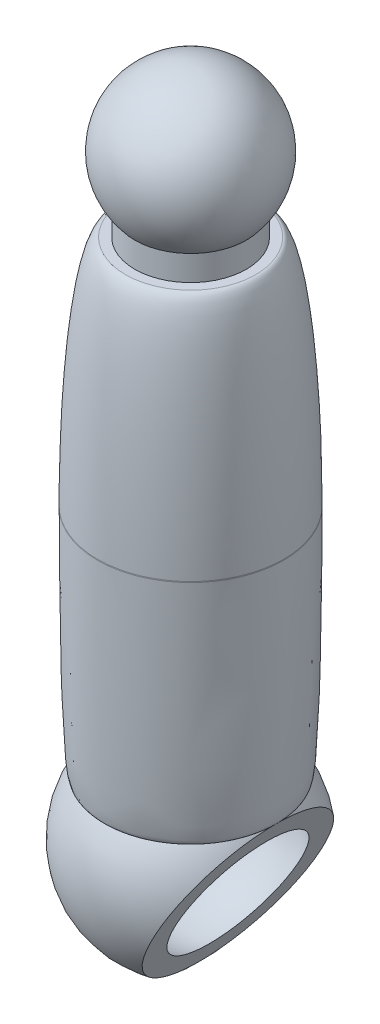
ISO-10303-21;
HEADER;
FILE_DESCRIPTION(('STEP AP214'),'2;1');
FILE_NAME('part.step','',(''),(''),'','','');
FILE_SCHEMA(('AUTOMOTIVE_DESIGN { 1 0 10303 214 1 1 1 1 }'));
ENDSEC;
DATA;
#1=APPLICATION_CONTEXT('core data for automotive mechanical design processes');
#2=APPLICATION_PROTOCOL_DEFINITION('international standard','automotive_design',2000,#1);
#3=PRODUCT_CONTEXT('',#1,'mechanical');
#4=PRODUCT('Part','Part','',(#3));
#5=PRODUCT_RELATED_PRODUCT_CATEGORY('part','',(#4));
#6=PRODUCT_DEFINITION_FORMATION('','',#4);
#7=PRODUCT_DEFINITION_CONTEXT('part definition',#1,'design');
#8=PRODUCT_DEFINITION('design','',#6,#7);
#9=PRODUCT_DEFINITION_SHAPE('','',#8);
#10=(LENGTH_UNIT() NAMED_UNIT(*) SI_UNIT(.MILLI.,.METRE.));
#11=(NAMED_UNIT(*) PLANE_ANGLE_UNIT() SI_UNIT($,.RADIAN.));
#12=(NAMED_UNIT(*) SI_UNIT($,.STERADIAN.) SOLID_ANGLE_UNIT());
#13=UNCERTAINTY_MEASURE_WITH_UNIT(LENGTH_MEASURE(1.E-05),#10,'distance_accuracy_value','');
#14=(GEOMETRIC_REPRESENTATION_CONTEXT(3) GLOBAL_UNCERTAINTY_ASSIGNED_CONTEXT((#13)) GLOBAL_UNIT_ASSIGNED_CONTEXT((#10,
#11,#12)) REPRESENTATION_CONTEXT('',''));
#15=CARTESIAN_POINT('',(0.,0.,0.));
#16=DIRECTION('',(0.,0.,1.));
#17=DIRECTION('',(1.,0.,0.));
#18=AXIS2_PLACEMENT_3D('',#15,#16,#17);
#19=CARTESIAN_POINT('',(0.,0.,0.));
#20=DIRECTION('',(0.,1.,0.));
#21=DIRECTION('',(-1.,0.,0.));
#22=AXIS2_PLACEMENT_3D('',#19,#20,#21);
#23=SPHERICAL_SURFACE('',#22,4.5);
#24=CARTESIAN_POINT('',(0.,3.,0.));
#25=DIRECTION('',(0.,1.,0.));
#26=DIRECTION('',(0.,0.,1.));
#27=AXIS2_PLACEMENT_3D('',#24,#25,#26);
#28=CIRCLE('',#27,3.35410196624968);
#29=CARTESIAN_POINT('',(0.,3.,3.35410196624968));
#30=VERTEX_POINT('',#29);
#31=EDGE_CURVE('E62',#30,#30,#28,.T.);
#32=ORIENTED_EDGE('',*,*,#31,.T.);
#33=EDGE_LOOP('',(#32));
#34=FACE_BOUND('',#33,.T.);
#35=CARTESIAN_POINT('',(2.54225355443142,-1.23973661113189,0.));
#36=DIRECTION('',(0.898822363917032,-0.438313082308296,0.));
#37=DIRECTION('',(0.438313082308296,0.898822363917032,0.));
#38=AXIS2_PLACEMENT_3D('',#35,#36,#37);
#39=CIRCLE('',#38,3.5);
#40=CARTESIAN_POINT('',(4.07634934251046,1.90614166257772,0.));
#41=VERTEX_POINT('',#40);
#42=EDGE_CURVE('E59',#41,#41,#39,.T.);
#43=ORIENTED_EDGE('',*,*,#42,.T.);
#44=EDGE_LOOP('',(#43));
#45=FACE_BOUND('',#44,.T.);
#46=ADVANCED_FACE('F38',(#34,#45),#23,.F.);
#47=CARTESIAN_POINT('',(0.,3.,0.));
#48=DIRECTION('',(0.,1.,0.));
#49=DIRECTION('',(0.,0.,1.));
#50=AXIS2_PLACEMENT_3D('',#47,#48,#49);
#51=PLANE('',#50);
#52=ORIENTED_EDGE('',*,*,#31,.F.);
#53=EDGE_LOOP('',(#52));
#54=FACE_BOUND('',#53,.T.);
#55=ADVANCED_FACE('F97',(#54),#51,.F.);
#56=CARTESIAN_POINT('',(0.474734880216405,-5.47947322226379,10.));
#57=DIRECTION('',(0.898822363917032,-0.438313082308296,0.));
#58=DIRECTION('',(0.438313082308296,0.898822363917032,0.));
#59=AXIS2_PLACEMENT_3D('',#56,#57,#58);
#60=PLANE('',#59);
#61=ORIENTED_EDGE('',*,*,#42,.F.);
#62=EDGE_LOOP('',(#61));
#63=FACE_BOUND('',#62,.T.);
#64=CARTESIAN_POINT('',(2.54225355443142,-1.23973661113189,0.));
#65=DIRECTION('',(0.898822363917032,-0.438313082308296,0.));
#66=DIRECTION('',(0.438313082308296,0.898822363917032,0.));
#67=AXIS2_PLACEMENT_3D('',#64,#65,#66);
#68=CIRCLE('',#67,4.7169905660283);
#69=CARTESIAN_POINT('',(4.60977222864644,3.,0.));
#70=VERTEX_POINT('',#69);
#71=EDGE_CURVE('E54',#70,#70,#68,.F.);
#72=ORIENTED_EDGE('',*,*,#71,.F.);
#73=EDGE_LOOP('',(#72));
#74=FACE_BOUND('',#73,.T.);
#75=ADVANCED_FACE('F55',(#63,#74),#60,.T.);
#76=CARTESIAN_POINT('',(0.,0.,0.));
#77=DIRECTION('',(0.,1.,0.));
#78=DIRECTION('',(1.,0.,0.));
#79=AXIS2_PLACEMENT_3D('',#76,#77,#78);
#80=SPHERICAL_SURFACE('',#79,5.5);
#81=CARTESIAN_POINT('',(0.,3.,4.60977222864644));
#82=CARTESIAN_POINT('',(0.603417765466815,3.,4.60977222864644));
#83=CARTESIAN_POINT('',(1.20659813581132,3.0000000000004,4.48979219322418));
#84=CARTESIAN_POINT('',(2.32156878194807,2.99999999999961,4.02795622994659));
#85=CARTESIAN_POINT('',(2.83292040875123,3.0000000000004,3.68628199645152));
#86=CARTESIAN_POINT('',(3.68628199645141,2.9999999999996,2.83292040875114));
#87=CARTESIAN_POINT('',(4.02795622994622,2.99999999999961,2.3215687819482));
#88=CARTESIAN_POINT('',(4.48979219322456,3.0000000000004,1.20659813581118));
#89=CARTESIAN_POINT('',(4.60977222864644,3.,0.603417765466814));
#90=CARTESIAN_POINT('',(4.60977222864644,3.,-0.603417765466815));
#91=CARTESIAN_POINT('',(4.48979219322436,3.0000000000004,-1.20659813581118));
#92=CARTESIAN_POINT('',(4.02795622994642,2.9999999999996,-2.3215687819482));
#93=CARTESIAN_POINT('',(3.68628199645158,3.,-2.83292040875127));
#94=CARTESIAN_POINT('',(2.83292040875107,3.,-3.68628199645138));
#95=CARTESIAN_POINT('',(2.32156878194814,2.9999999999996,-4.02795622994686));
#96=CARTESIAN_POINT('',(1.20659813581124,3.0000000000004,-4.48979219322392));
#97=CARTESIAN_POINT('',(0.603417765466772,3.,-4.60977222864644));
#98=CARTESIAN_POINT('',(-0.603417765466772,3.,-4.60977222864644));
#99=CARTESIAN_POINT('',(-1.20659813581173,3.0000000000004,-4.48979219322392));
#100=CARTESIAN_POINT('',(-2.32156878194765,2.9999999999996,-4.02795622994686));
#101=CARTESIAN_POINT('',(-2.83292040875087,3.0000000000004,-3.68628199645158));
#102=CARTESIAN_POINT('',(-3.68628199645178,2.9999999999996,-2.83292040875107));
#103=CARTESIAN_POINT('',(-4.02795622994662,2.99999999999961,-2.32156878194781));
#104=CARTESIAN_POINT('',(-4.48979219322416,3.0000000000004,-1.20659813581158));
#105=CARTESIAN_POINT('',(-4.60977222864644,3.,-0.603417765466348));
#106=CARTESIAN_POINT('',(-4.60977222864644,3.,0.603417765466342));
#107=CARTESIAN_POINT('',(-4.48979219322376,3.0000000000004,1.20659813581163));
#108=CARTESIAN_POINT('',(-4.02795622994701,2.99999999999961,2.32156878194776));
#109=CARTESIAN_POINT('',(-3.68628199645161,2.9999999999996,2.83292040875103));
#110=CARTESIAN_POINT('',(-2.83292040875104,3.0000000000004,3.68628199645161));
#111=CARTESIAN_POINT('',(-2.32156878194821,2.9999999999996,4.0279562299466));
#112=CARTESIAN_POINT('',(-1.20659813581116,3.0000000000004,4.48979219322418));
#113=CARTESIAN_POINT('',(-0.603417765466813,3.,4.60977222864644));
#114=CARTESIAN_POINT('',(0.,3.,4.60977222864644));
#115=(BOUNDED_CURVE() B_SPLINE_CURVE(3,(#81,#82,#83,#84,#85,#86,#87,#88,#89,#90,#91,#92,#93,#94,
#95,#96,#97,#98,#99,#100,#101,#102,#103,#104,#105,#106,#107,#108,#109,#110,#111,#112,#113,#114),
.UNSPECIFIED.,.T.,.F.) B_SPLINE_CURVE_WITH_KNOTS((4,2,2,2,2,2,2,2,2,2,2,2,2,2,2,2,4),
(-3.14159265358979,-2.74889357189107,-2.35619449019234,-1.96349540849362,-1.5707963267949,
-1.17809724509617,-0.785398163397448,-0.392699081698724,0.,0.392699081698724,0.785398163397448,
1.17809724509617,1.5707963267949,1.96349540849362,2.35619449019234,2.74889357189107,
3.14159265358979),
.UNSPECIFIED.) CURVE() GEOMETRIC_REPRESENTATION_ITEM() RATIONAL_B_SPLINE_CURVE((1.,1.,1.,1.,1.,
1.,1.,1.,1.,1.,1.,1.,1.,1.,1.,1.,1.,1.,1.,1.,1.,1.,1.,1.,1.,1.,1.,1.,1.,1.,1.,1.,1.,1.)) REPRESENTATION_ITEM(''));
#116=EDGE_CURVE('E70',#70,#70,#115,.F.);
#117=ORIENTED_EDGE('',*,*,#116,.T.);
#118=ORIENTED_EDGE('',*,*,#71,.T.);
#119=EDGE_LOOP('',(#117,#118));
#120=FACE_BOUND('',#119,.T.);
#121=ADVANCED_FACE('F104',(#120),#80,.T.);
#122=CARTESIAN_POINT('',(0.,28.,0.));
#123=DIRECTION('',(0.,-1.,0.));
#124=DIRECTION('',(0.,0.,-1.));
#125=AXIS2_PLACEMENT_3D('',#122,#123,#124);
#126=CYLINDRICAL_SURFACE('',#125,5.);
#127=CARTESIAN_POINT('',(0.,15.4506387627513,5.));
#128=CARTESIAN_POINT('',(-0.654498460593132,15.4506387627513,5.));
#129=CARTESIAN_POINT('',(-1.30873943002339,15.4506387627517,4.86986337993385));
#130=CARTESIAN_POINT('',(-2.51809489362749,15.4506387627509,4.36893194517903));
#131=CARTESIAN_POINT('',(-3.07273360617101,15.4506387627525,3.99833420569446));
#132=CARTESIAN_POINT('',(-3.99833420569447,15.4506387627501,3.07273360617101));
#133=CARTESIAN_POINT('',(-4.36893194517922,15.4506387627509,2.51809489362703));
#134=CARTESIAN_POINT('',(-4.86986337993365,15.4506387627517,1.30873943002388));
#135=CARTESIAN_POINT('',(-5.,15.4506387627513,0.654498460592621));
#136=CARTESIAN_POINT('',(-5.,15.4506387627513,-0.654498460592627));
#137=CARTESIAN_POINT('',(-4.86986337993369,15.4506387627517,-1.30873943002378));
#138=CARTESIAN_POINT('',(-4.36893194517918,15.4506387627509,-2.51809489362712));
#139=CARTESIAN_POINT('',(-3.99833420569449,15.4506387627505,-3.07273360617098));
#140=CARTESIAN_POINT('',(-3.07273360617098,15.4506387627521,-3.9983342056945));
#141=CARTESIAN_POINT('',(-2.51809489362705,15.4506387627509,-4.36893194517921));
#142=CARTESIAN_POINT('',(-1.30873943002385,15.4506387627517,-4.86986337993366));
#143=CARTESIAN_POINT('',(-0.654498460593086,15.4506387627513,-5.));
#144=CARTESIAN_POINT('',(0.654498460593086,15.4506387627513,-5.));
#145=CARTESIAN_POINT('',(1.3087394300234,15.4506387627517,-4.86986337993384));
#146=CARTESIAN_POINT('',(2.5180948936275,15.4506387627509,-4.36893194517902));
#147=CARTESIAN_POINT('',(3.07273360617128,15.4506387627513,-3.9983342056942));
#148=CARTESIAN_POINT('',(3.9983342056942,15.4506387627513,-3.07273360617128));
#149=CARTESIAN_POINT('',(4.36893194517899,15.4506387627509,-2.51809489362759));
#150=CARTESIAN_POINT('',(4.86986337993388,15.4506387627517,-1.30873943002331));
#151=CARTESIAN_POINT('',(5.,15.4506387627513,-0.654498460593133));
#152=CARTESIAN_POINT('',(5.,15.4506387627513,0.654498460593133));
#153=CARTESIAN_POINT('',(4.86986337993391,15.4506387627517,1.30873943002324));
#154=CARTESIAN_POINT('',(4.36893194517896,15.4506387627509,2.51809489362766));
#155=CARTESIAN_POINT('',(3.99833420569426,15.4506387627501,3.07273360617121));
#156=CARTESIAN_POINT('',(3.07273360617121,15.4506387627525,3.99833420569427));
#157=CARTESIAN_POINT('',(2.51809489362745,15.4506387627509,4.36893194517904));
#158=CARTESIAN_POINT('',(1.30873943002346,15.4506387627517,4.86986337993382));
#159=CARTESIAN_POINT('',(0.654498460593133,15.4506387627513,5.));
#160=CARTESIAN_POINT('',(0.,15.4506387627513,5.));
#161=(BOUNDED_CURVE() B_SPLINE_CURVE(3,(#127,#128,#129,#130,#131,#132,#133,#134,#135,#136,#137,
#138,#139,#140,#141,#142,#143,#144,#145,#146,#147,#148,#149,#150,#151,#152,#153,#154,#155,#156,
#157,#158,#159,#160),.UNSPECIFIED.,.T.,.F.) B_SPLINE_CURVE_WITH_KNOTS((4,2,2,2,2,2,2,2,2,2,2,2,
2,2,2,2,4),(-3.14159265358979,-2.74889357189107,-2.35619449019234,-1.96349540849362,
-1.5707963267949,-1.17809724509617,-0.785398163397448,-0.392699081698724,0.,0.392699081698724,
0.785398163397448,1.17809724509617,1.5707963267949,1.96349540849362,2.35619449019234,
2.74889357189107,3.14159265358979),
.UNSPECIFIED.) CURVE() GEOMETRIC_REPRESENTATION_ITEM() RATIONAL_B_SPLINE_CURVE((1.,1.,1.,1.,1.,
1.,1.,1.,1.,1.,1.,1.,1.,1.,1.,1.,1.,1.,1.,1.,1.,1.,1.,1.,1.,1.,1.,1.,1.,1.,1.,1.,1.,1.)) REPRESENTATION_ITEM(''));
#162=CARTESIAN_POINT('',(0.,15.4506387627513,5.));
#163=VERTEX_POINT('',#162);
#164=EDGE_CURVE('E12',#163,#163,#161,.F.);
#165=ORIENTED_EDGE('',*,*,#164,.T.);
#166=EDGE_LOOP('',(#165));
#167=FACE_BOUND('',#166,.T.);
#168=CARTESIAN_POINT('',(0.,15.5,5.));
#169=CARTESIAN_POINT('',(1.30899692118617,15.5,5.));
#170=CARTESIAN_POINT('',(2.60993330640972,15.5,4.46113450545575));
#171=CARTESIAN_POINT('',(4.46113450545575,15.5,2.60993330640972));
#172=CARTESIAN_POINT('',(5.,15.5,1.30899692118627));
#173=CARTESIAN_POINT('',(5.,15.5,-1.30899692118626));
#174=CARTESIAN_POINT('',(4.46113450545589,15.5,-2.60993330640959));
#175=CARTESIAN_POINT('',(2.60993330640958,15.5,-4.46113450545589));
#176=CARTESIAN_POINT('',(1.30899692118627,15.5,-5.));
#177=CARTESIAN_POINT('',(-1.30899692118626,15.5,-5.));
#178=CARTESIAN_POINT('',(-2.60993330640929,15.5,-4.46113450545619));
#179=CARTESIAN_POINT('',(-4.46113450545619,15.5,-2.60993330640928));
#180=CARTESIAN_POINT('',(-5.,15.5,-1.30899692118626));
#181=CARTESIAN_POINT('',(-5.,15.5,1.30899692118627));
#182=CARTESIAN_POINT('',(-4.46113450545605,15.5,2.60993330640942));
#183=CARTESIAN_POINT('',(-2.60993330640945,15.5,4.46113450545603));
#184=CARTESIAN_POINT('',(-1.30899692118617,15.5,5.));
#185=CARTESIAN_POINT('',(0.,15.5,5.));
#186=(BOUNDED_CURVE() B_SPLINE_CURVE(3,(#168,#169,#170,#171,#172,#173,#174,#175,#176,#177,#178,
#179,#180,#181,#182,#183,#184,#185),.UNSPECIFIED.,.T.,.F.) B_SPLINE_CURVE_WITH_KNOTS((4,2,2,2,2,
2,2,2,4),(0.,0.785398163397448,1.5707963267949,2.35619449019234,3.14159265358979,
3.92699081698724,4.71238898038469,5.49778714378214,6.28318530717959),
.UNSPECIFIED.) CURVE() GEOMETRIC_REPRESENTATION_ITEM() RATIONAL_B_SPLINE_CURVE((1.,1.,1.,1.,1.,
1.,1.,1.,1.,1.,1.,1.,1.,1.,1.,1.,1.,1.)) REPRESENTATION_ITEM(''));
#187=CARTESIAN_POINT('',(0.,15.5,5.));
#188=VERTEX_POINT('',#187);
#189=EDGE_CURVE('E50',#188,#188,#186,.F.);
#190=ORIENTED_EDGE('',*,*,#189,.T.);
#191=EDGE_LOOP('',(#190));
#192=FACE_BOUND('',#191,.T.);
#193=ADVANCED_FACE('F93',(#167,#192),#126,.T.);
#194=CARTESIAN_POINT('',(0.,28.,0.));
#195=DIRECTION('',(0.,1.,0.));
#196=DIRECTION('',(0.,0.,1.));
#197=AXIS2_PLACEMENT_3D('',#194,#195,#196);
#198=PLANE('',#197);
#199=CARTESIAN_POINT('',(0.,28.,0.));
#200=DIRECTION('',(0.,1.,0.));
#201=DIRECTION('',(0.,0.,1.));
#202=AXIS2_PLACEMENT_3D('',#199,#200,#201);
#203=CIRCLE('',#202,3.);
#204=CARTESIAN_POINT('',(0.,28.,3.));
#205=VERTEX_POINT('',#204);
#206=EDGE_CURVE('E58',#205,#205,#203,.T.);
#207=ORIENTED_EDGE('',*,*,#206,.F.);
#208=EDGE_LOOP('',(#207));
#209=FACE_BOUND('',#208,.T.);
#210=CARTESIAN_POINT('',(0.,28.,3.5));
#211=CARTESIAN_POINT('',(-0.0572519020929821,28.,3.50000065654502));
#212=CARTESIAN_POINT('',(-0.114501352297191,28.,3.4985274254307));
#213=CARTESIAN_POINT('',(-0.228830553805316,28.,3.49268493495314));
#214=CARTESIAN_POINT('',(-0.2859103619496,28.,3.48831679059674));
#215=CARTESIAN_POINT('',(-0.399773504005563,28.,3.47673678120868));
#216=CARTESIAN_POINT('',(-0.456556869908134,28.,3.46952522973445));
#217=CARTESIAN_POINT('',(-0.569702187088814,28.,3.45231130579406));
#218=CARTESIAN_POINT('',(-0.626064111505363,28.,3.44230875696804));
#219=CARTESIAN_POINT('',(-0.73824114641773,28.,3.41956517406787));
#220=CARTESIAN_POINT('',(-0.794056172469005,28.,3.40682372384586));
#221=CARTESIAN_POINT('',(-0.905014123122137,28.,3.37865449808789));
#222=CARTESIAN_POINT('',(-0.960156929651774,28.,3.36322625770181));
#223=CARTESIAN_POINT('',(-1.06964508442056,28.,3.32973540664632));
#224=CARTESIAN_POINT('',(-1.12399031701326,28.,3.31167241801779));
#225=CARTESIAN_POINT('',(-1.23175793157194,28.,3.27296389858));
#226=CARTESIAN_POINT('',(-1.28518023914935,28.,3.25231816069395));
#227=CARTESIAN_POINT('',(-1.39097656387671,28.,3.20849588820872));
#228=CARTESIAN_POINT('',(-1.44335058102665,28.,3.18531935360954));
#229=CARTESIAN_POINT('',(-1.54692484874385,28.,3.13648719884697));
#230=CARTESIAN_POINT('',(-1.59812519313584,28.,3.11083177770968));
#231=CARTESIAN_POINT('',(-1.69922661732964,28.,3.05709356998916));
#232=CARTESIAN_POINT('',(-1.74912788261462,28.,3.0290111324375));
#233=CARTESIAN_POINT('',(-1.84750565398307,28.,2.97047065961108));
#234=CARTESIAN_POINT('',(-1.89598240527512,28.,2.94001303652587));
#235=CARTESIAN_POINT('',(-1.99138568352208,28.,2.87677405124166));
#236=CARTESIAN_POINT('',(-2.03831244502814,28.,2.84399304301098));
#237=CARTESIAN_POINT('',(-2.13049036905155,28.,2.77615924798457));
#238=CARTESIAN_POINT('',(-2.17574163727792,28.,2.74110660489426));
#239=CARTESIAN_POINT('',(-2.26444326330193,28.,2.66878171843572));
#240=CARTESIAN_POINT('',(-2.30789342198727,28.,2.63150923076808));
#241=CARTESIAN_POINT('',(-2.39286792780793,28.,2.55479675682628));
#242=CARTESIAN_POINT('',(-2.43439152689834,28.,2.51535594140751));
#243=CARTESIAN_POINT('',(-2.51535594140751,28.,2.43439152689831));
#244=CARTESIAN_POINT('',(-2.55479675682628,28.,2.3928679278079));
#245=CARTESIAN_POINT('',(-2.63150923076805,28.,2.30789342198721));
#246=CARTESIAN_POINT('',(-2.66878171843567,28.,2.26444326330185));
#247=CARTESIAN_POINT('',(-2.74110660489422,28.,2.17574163727786));
#248=CARTESIAN_POINT('',(-2.77615924798454,28.,2.13049036905153));
#249=CARTESIAN_POINT('',(-2.84399304301089,28.,2.038312445028));
#250=CARTESIAN_POINT('',(-2.8767740512415,28.,1.9913856835218));
#251=CARTESIAN_POINT('',(-2.94001303652589,28.,1.89598240527522));
#252=CARTESIAN_POINT('',(-2.97047065961134,28.,1.84750565398371));
#253=CARTESIAN_POINT('',(-3.02901113243709,28.,1.74912788261381));
#254=CARTESIAN_POINT('',(-3.05709356998783,28.,1.69922661732686));
#255=CARTESIAN_POINT('',(-3.11083177771086,28.,1.59812519313846));
#256=CARTESIAN_POINT('',(-3.13648719885157,28.,1.54692484875386));
#257=CARTESIAN_POINT('',(-3.1853193536048,28.,1.44335058101651));
#258=CARTESIAN_POINT('',(-3.2084958881912,28.,1.39097656383903));
#259=CARTESIAN_POINT('',(-3.25231816071133,28.,1.28518023918692));
#260=CARTESIAN_POINT('',(-3.27296389864506,28.,1.2317579317123));
#261=CARTESIAN_POINT('',(-3.31167241795262,28.,1.12399031687283));
#262=CARTESIAN_POINT('',(-3.32973540640327,28.,1.0696450838966));
#263=CARTESIAN_POINT('',(-3.36322625794474,28.,0.96015693017561));
#264=CARTESIAN_POINT('',(-3.37865449899456,28.,0.905014125077042));
#265=CARTESIAN_POINT('',(-3.40682372293928,28.,0.794056170514418));
#266=CARTESIAN_POINT('',(-3.41956517068485,28.,0.738241139123752));
#267=CARTESIAN_POINT('',(-3.44230876035049,28.,0.626064118798234));
#268=CARTESIAN_POINT('',(-3.45231131841665,28.,0.569702214304081));
#269=CARTESIAN_POINT('',(-3.46952521711263,28.,0.456556842694607));
#270=CARTESIAN_POINT('',(-3.47673673410507,28.,0.399773402446803));
#271=CARTESIAN_POINT('',(-3.48831683770552,28.,0.285910463519586));
#272=CARTESIAN_POINT('',(-3.49268511077409,28.,0.228830932888074));
#273=CARTESIAN_POINT('',(-3.49852724954204,28.,0.11450097306848));
#274=CARTESIAN_POINT('',(-3.5,28.,0.0572504865342427));
#275=CARTESIAN_POINT('',(-3.5,28.,-0.0572504865342317));
#276=CARTESIAN_POINT('',(-3.49852724954204,28.,-0.114500973068469));
#277=CARTESIAN_POINT('',(-3.4926851107741,28.,-0.228830932888063));
#278=CARTESIAN_POINT('',(-3.48831683770553,28.,-0.285910463519576));
#279=CARTESIAN_POINT('',(-3.47673673410508,28.,-0.399773402446793));
#280=CARTESIAN_POINT('',(-3.46952521711264,28.,-0.456556842694598));
#281=CARTESIAN_POINT('',(-3.45231131841666,28.,-0.569702214304073));
#282=CARTESIAN_POINT('',(-3.44230876035051,28.,-0.626064118798227));
#283=CARTESIAN_POINT('',(-3.41956517068488,28.,-0.738241139123746));
#284=CARTESIAN_POINT('',(-3.40682372293931,28.,-0.794056170514412));
#285=CARTESIAN_POINT('',(-3.3786544989946,28.,-0.905014125077039));
#286=CARTESIAN_POINT('',(-3.36322625794478,28.,-0.960156930175607));
#287=CARTESIAN_POINT('',(-3.32973540640332,28.,-1.0696450838966));
#288=CARTESIAN_POINT('',(-3.31167241795268,28.,-1.12399031687283));
#289=CARTESIAN_POINT('',(-3.27296389864512,28.,-1.2317579317123));
#290=CARTESIAN_POINT('',(-3.25231816071139,28.,-1.28518023918693));
#291=CARTESIAN_POINT('',(-3.20849588819127,28.,-1.39097656383903));
#292=CARTESIAN_POINT('',(-3.18531935360487,28.,-1.44335058101651));
#293=CARTESIAN_POINT('',(-3.13648719885165,28.,-1.54692484875386));
#294=CARTESIAN_POINT('',(-3.11083177771094,28.,-1.59812519313847));
#295=CARTESIAN_POINT('',(-3.05709356998791,28.,-1.69922661732686));
#296=CARTESIAN_POINT('',(-3.02901113243717,28.,-1.74912788261382));
#297=CARTESIAN_POINT('',(-2.97047065961141,28.,-1.84750565398372));
#298=CARTESIAN_POINT('',(-2.94001303652596,28.,-1.89598240527523));
#299=CARTESIAN_POINT('',(-2.87677405124158,28.,-1.99138568352181));
#300=CARTESIAN_POINT('',(-2.84399304301096,28.,-2.03831244502801));
#301=CARTESIAN_POINT('',(-2.7761592479846,28.,-2.13049036905154));
#302=CARTESIAN_POINT('',(-2.74110660489427,28.,-2.17574163727787));
#303=CARTESIAN_POINT('',(-2.66878171843571,28.,-2.26444326330186));
#304=CARTESIAN_POINT('',(-2.63150923076808,28.,-2.30789342198722));
#305=CARTESIAN_POINT('',(-2.55479675682629,28.,-2.3928679278079));
#306=CARTESIAN_POINT('',(-2.51535594140751,28.,-2.43439152689832));
#307=CARTESIAN_POINT('',(-2.43439152689832,28.,-2.51535594140751));
#308=CARTESIAN_POINT('',(-2.39286792780791,28.,-2.55479675682629));
#309=CARTESIAN_POINT('',(-2.30789342198722,28.,-2.63150923076808));
#310=CARTESIAN_POINT('',(-2.26444326330187,28.,-2.66878171843571));
#311=CARTESIAN_POINT('',(-2.17574163727787,28.,-2.74110660489427));
#312=CARTESIAN_POINT('',(-2.13049036905154,28.,-2.7761592479846));
#313=CARTESIAN_POINT('',(-2.03831244502801,28.,-2.84399304301095));
#314=CARTESIAN_POINT('',(-1.99138568352182,28.,-2.87677405124157));
#315=CARTESIAN_POINT('',(-1.89598240527523,28.,-2.94001303652596));
#316=CARTESIAN_POINT('',(-1.84750565398372,28.,-2.97047065961141));
#317=CARTESIAN_POINT('',(-1.74912788261382,28.,-3.02901113243717));
#318=CARTESIAN_POINT('',(-1.69922661732687,28.,-3.05709356998791));
#319=CARTESIAN_POINT('',(-1.59812519313847,28.,-3.11083177771093));
#320=CARTESIAN_POINT('',(-1.54692484875387,28.,-3.13648719885165));
#321=CARTESIAN_POINT('',(-1.44335058101651,28.,-3.18531935360487));
#322=CARTESIAN_POINT('',(-1.39097656383903,28.,-3.20849588819127));
#323=CARTESIAN_POINT('',(-1.28518023918693,28.,-3.25231816071139));
#324=CARTESIAN_POINT('',(-1.23175793171231,28.,-3.27296389864512));
#325=CARTESIAN_POINT('',(-1.12399031687284,28.,-3.31167241795267));
#326=CARTESIAN_POINT('',(-1.0696450838966,28.,-3.32973540640332));
#327=CARTESIAN_POINT('',(-0.960156930175611,28.,-3.36322625794478));
#328=CARTESIAN_POINT('',(-0.905014125077043,28.,-3.3786544989946));
#329=CARTESIAN_POINT('',(-0.794056170514417,28.,-3.40682372293931));
#330=CARTESIAN_POINT('',(-0.738241139123751,28.,-3.41956517068488));
#331=CARTESIAN_POINT('',(-0.626064118798231,28.,-3.44230876035051));
#332=CARTESIAN_POINT('',(-0.569702214304077,28.,-3.45231131841666));
#333=CARTESIAN_POINT('',(-0.456556842694603,28.,-3.46952521711264));
#334=CARTESIAN_POINT('',(-0.399773402446799,28.,-3.47673673410508));
#335=CARTESIAN_POINT('',(-0.285910463519582,28.,-3.48831683770553));
#336=CARTESIAN_POINT('',(-0.228830932888069,28.,-3.4926851107741));
#337=CARTESIAN_POINT('',(-0.114500973068474,28.,-3.49852724954204));
#338=CARTESIAN_POINT('',(-0.0572504865342368,28.,-3.5));
#339=CARTESIAN_POINT('',(0.0572504865342384,28.,-3.5));
#340=CARTESIAN_POINT('',(0.114500973068476,28.,-3.49852724954204));
#341=CARTESIAN_POINT('',(0.228830932888074,28.,-3.49268511077409));
#342=CARTESIAN_POINT('',(0.285910463519589,28.,-3.48831683770552));
#343=CARTESIAN_POINT('',(0.39977340244681,28.,-3.47673673410507));
#344=CARTESIAN_POINT('',(0.456556842694617,28.,-3.46952521711263));
#345=CARTESIAN_POINT('',(0.569702214304098,28.,-3.45231131841664));
#346=CARTESIAN_POINT('',(0.626064118798256,28.,-3.44230876035049));
#347=CARTESIAN_POINT('',(0.738241139123783,28.,-3.41956517068485));
#348=CARTESIAN_POINT('',(0.794056170514453,28.,-3.40682372293927));
#349=CARTESIAN_POINT('',(0.905014125077087,28.,-3.37865449899455));
#350=CARTESIAN_POINT('',(0.96015693017566,28.,-3.36322625794473));
#351=CARTESIAN_POINT('',(1.06964508389666,28.,-3.32973540640327));
#352=CARTESIAN_POINT('',(1.1239903168729,28.,-3.31167241795262));
#353=CARTESIAN_POINT('',(1.23175793171237,28.,-3.27296389864505));
#354=CARTESIAN_POINT('',(1.285180239187,28.,-3.25231816071132));
#355=CARTESIAN_POINT('',(1.39097656383911,28.,-3.20849588819119));
#356=CARTESIAN_POINT('',(1.44335058101659,28.,-3.18531935360479));
#357=CARTESIAN_POINT('',(1.54692484875395,28.,-3.13648719885157));
#358=CARTESIAN_POINT('',(1.59812519313856,28.,-3.11083177771085));
#359=CARTESIAN_POINT('',(1.69922661732695,28.,-3.05709356998782));
#360=CARTESIAN_POINT('',(1.74912788261391,28.,-3.02901113243708));
#361=CARTESIAN_POINT('',(1.84750565398381,28.,-2.97047065961133));
#362=CARTESIAN_POINT('',(1.89598240527532,28.,-2.94001303652588));
#363=CARTESIAN_POINT('',(1.99138568352189,28.,-2.87677405124149));
#364=CARTESIAN_POINT('',(2.03831244502809,28.,-2.84399304301088));
#365=CARTESIAN_POINT('',(2.13049036905161,28.,-2.77615924798453));
#366=CARTESIAN_POINT('',(2.17574163727793,28.,-2.74110660489421));
#367=CARTESIAN_POINT('',(2.26444326330191,28.,-2.66878171843567));
#368=CARTESIAN_POINT('',(2.30789342198726,28.,-2.63150923076804));
#369=CARTESIAN_POINT('',(2.39286792780793,28.,-2.55479675682627));
#370=CARTESIAN_POINT('',(2.43439152689833,28.,-2.5153559414075));
#371=CARTESIAN_POINT('',(2.5153559414075,28.,-2.43439152689833));
#372=CARTESIAN_POINT('',(2.55479675682627,28.,-2.39286792780793));
#373=CARTESIAN_POINT('',(2.63150923076804,28.,-2.30789342198726));
#374=CARTESIAN_POINT('',(2.66878171843566,28.,-2.26444326330192));
#375=CARTESIAN_POINT('',(2.7411066048942,28.,-2.17574163727793));
#376=CARTESIAN_POINT('',(2.77615924798453,28.,-2.13049036905161));
#377=CARTESIAN_POINT('',(2.84399304301087,28.,-2.03831244502809));
#378=CARTESIAN_POINT('',(2.87677405124149,28.,-1.9913856835219));
#379=CARTESIAN_POINT('',(2.94001303652587,28.,-1.89598240527532));
#380=CARTESIAN_POINT('',(2.97047065961132,28.,-1.84750565398381));
#381=CARTESIAN_POINT('',(3.02901113243708,28.,-1.74912788261391));
#382=CARTESIAN_POINT('',(3.05709356998782,28.,-1.69922661732695));
#383=CARTESIAN_POINT('',(3.11083177771085,28.,-1.59812519313856));
#384=CARTESIAN_POINT('',(3.13648719885156,28.,-1.54692484875395));
#385=CARTESIAN_POINT('',(3.18531935360479,28.,-1.44335058101659));
#386=CARTESIAN_POINT('',(3.20849588819119,28.,-1.39097656383911));
#387=CARTESIAN_POINT('',(3.25231816071132,28.,-1.285180239187));
#388=CARTESIAN_POINT('',(3.27296389864505,28.,-1.23175793171237));
#389=CARTESIAN_POINT('',(3.31167241795261,28.,-1.1239903168729));
#390=CARTESIAN_POINT('',(3.32973540640326,28.,-1.06964508389666));
#391=CARTESIAN_POINT('',(3.36322625794473,28.,-0.96015693017566));
#392=CARTESIAN_POINT('',(3.37865449899455,28.,-0.905014125077088));
#393=CARTESIAN_POINT('',(3.40682372293927,28.,-0.794056170514453));
#394=CARTESIAN_POINT('',(3.41956517068485,28.,-0.738241139123783));
#395=CARTESIAN_POINT('',(3.44230876035049,28.,-0.626064118798255));
#396=CARTESIAN_POINT('',(3.45231131841664,28.,-0.569702214304098));
#397=CARTESIAN_POINT('',(3.46952521711262,28.,-0.456556842694617));
#398=CARTESIAN_POINT('',(3.47673673410507,28.,-0.39977340244681));
#399=CARTESIAN_POINT('',(3.48831683770552,28.,-0.285910463519589));
#400=CARTESIAN_POINT('',(3.49268511077409,28.,-0.228830932888074));
#401=CARTESIAN_POINT('',(3.49852724954204,28.,-0.114500973068476));
#402=CARTESIAN_POINT('',(3.5,28.,-0.057250486534238));
#403=CARTESIAN_POINT('',(3.5,28.,0.057250486534239));
#404=CARTESIAN_POINT('',(3.49852724954204,28.,0.114500973068478));
#405=CARTESIAN_POINT('',(3.49268511077409,28.,0.228830932888077));
#406=CARTESIAN_POINT('',(3.48831683770552,28.,0.285910463519594));
#407=CARTESIAN_POINT('',(3.47673673410507,28.,0.399773402446819));
#408=CARTESIAN_POINT('',(3.46952521711263,28.,0.456556842694627));
#409=CARTESIAN_POINT('',(3.45231131841665,28.,0.569702214304113));
#410=CARTESIAN_POINT('',(3.4423087603505,28.,0.626064118798273));
#411=CARTESIAN_POINT('',(3.41956517068486,28.,0.738241139123807));
#412=CARTESIAN_POINT('',(3.40682372293928,28.,0.79405617051448));
#413=CARTESIAN_POINT('',(3.37865449899456,28.,0.90501412507712));
#414=CARTESIAN_POINT('',(3.36322625794475,28.,0.960156930175695));
#415=CARTESIAN_POINT('',(3.32973540640328,28.,1.0696450838967));
#416=CARTESIAN_POINT('',(3.31167241795263,28.,1.12399031687294));
#417=CARTESIAN_POINT('',(3.27296389864507,28.,1.23175793171242));
#418=CARTESIAN_POINT('',(3.25231816071134,28.,1.28518023918705));
#419=CARTESIAN_POINT('',(3.20849588819121,28.,1.39097656383917));
#420=CARTESIAN_POINT('',(3.18531935360481,28.,1.44335058101665));
#421=CARTESIAN_POINT('',(3.13648719885159,28.,1.54692484875401));
#422=CARTESIAN_POINT('',(3.11083177771087,28.,1.59812519313862));
#423=CARTESIAN_POINT('',(3.05709356998784,28.,1.69922661732702));
#424=CARTESIAN_POINT('',(3.0290111324371,28.,1.74912788261397));
#425=CARTESIAN_POINT('',(2.97047065961135,28.,1.84750565398387));
#426=CARTESIAN_POINT('',(2.9400130365259,28.,1.89598240527538));
#427=CARTESIAN_POINT('',(2.87677405124151,28.,1.99138568352195));
#428=CARTESIAN_POINT('',(2.8439930430109,28.,2.03831244502815));
#429=CARTESIAN_POINT('',(2.77615924798455,28.,2.13049036905166));
#430=CARTESIAN_POINT('',(2.74110660489422,28.,2.17574163727798));
#431=CARTESIAN_POINT('',(2.66878171843568,28.,2.26444326330195));
#432=CARTESIAN_POINT('',(2.63150923076805,28.,2.30789342198729));
#433=CARTESIAN_POINT('',(2.55479675682628,28.,2.39286792780794));
#434=CARTESIAN_POINT('',(2.51535594140751,28.,2.43439152689834));
#435=CARTESIAN_POINT('',(2.43439152689833,28.,2.51535594140749));
#436=CARTESIAN_POINT('',(2.39286792780792,28.,2.55479675682625));
#437=CARTESIAN_POINT('',(2.30789342198725,28.,2.63150923076801));
#438=CARTESIAN_POINT('',(2.26444326330191,28.,2.66878171843563));
#439=CARTESIAN_POINT('',(2.1757416372779,28.,2.74110660489415));
#440=CARTESIAN_POINT('',(2.13049036905153,28.,2.77615924798446));
#441=CARTESIAN_POINT('',(2.03831244502811,28.,2.84399304301084));
#442=CARTESIAN_POINT('',(1.99138568352206,28.,2.87677405124152));
#443=CARTESIAN_POINT('',(1.89598240527509,28.,2.94001303652572));
#444=CARTESIAN_POINT('',(1.84750565398305,28.,2.97047065961093));
#445=CARTESIAN_POINT('',(1.74912788261459,28.,3.02901113243735));
#446=CARTESIAN_POINT('',(1.69922661732961,28.,3.05709356998901));
#447=CARTESIAN_POINT('',(1.59812519313582,28.,3.11083177770953));
#448=CARTESIAN_POINT('',(1.54692484874383,28.,3.13648719884683));
#449=CARTESIAN_POINT('',(1.44335058102663,28.,3.18531935360941));
#450=CARTESIAN_POINT('',(1.39097656387669,28.,3.20849588820858));
#451=CARTESIAN_POINT('',(1.28518023914933,28.,3.25231816069382));
#452=CARTESIAN_POINT('',(1.23175793157193,28.,3.27296389857988));
#453=CARTESIAN_POINT('',(1.12399031701325,28.,3.31167241801769));
#454=CARTESIAN_POINT('',(1.06964508442055,28.,3.32973540664623));
#455=CARTESIAN_POINT('',(0.960156929651763,28.,3.36322625770173));
#456=CARTESIAN_POINT('',(0.905014123122127,28.,3.37865449808782));
#457=CARTESIAN_POINT('',(0.794056172468997,28.,3.40682372384579));
#458=CARTESIAN_POINT('',(0.738241146417722,28.,3.41956517406782));
#459=CARTESIAN_POINT('',(0.626064111505357,28.,3.44230875696799));
#460=CARTESIAN_POINT('',(0.569702187088808,28.,3.45231130579402));
#461=CARTESIAN_POINT('',(0.456556869908131,28.,3.46952522973442));
#462=CARTESIAN_POINT('',(0.399773504005561,28.,3.47673678120866));
#463=CARTESIAN_POINT('',(0.285910361949599,28.,3.48831679059673));
#464=CARTESIAN_POINT('',(0.228830553805316,28.,3.49268493495314));
#465=CARTESIAN_POINT('',(0.114501352297191,28.,3.4985274254307));
#466=CARTESIAN_POINT('',(0.0572519020929821,28.,3.50000065654502));
#467=CARTESIAN_POINT('',(0.,28.,3.5));
#468=B_SPLINE_CURVE_WITH_KNOTS('',3,(#210,#211,#212,#213,#214,#215,#216,#217,#218,#219,#220,
#221,#222,#223,#224,#225,#226,#227,#228,#229,#230,#231,#232,#233,#234,#235,#236,#237,#238,#239,
#240,#241,#242,#243,#244,#245,#246,#247,#248,#249,#250,#251,#252,#253,#254,#255,#256,#257,#258,
#259,#260,#261,#262,#263,#264,#265,#266,#267,#268,#269,#270,#271,#272,#273,#274,#275,#276,#277,
#278,#279,#280,#281,#282,#283,#284,#285,#286,#287,#288,#289,#290,#291,#292,#293,#294,#295,#296,
#297,#298,#299,#300,#301,#302,#303,#304,#305,#306,#307,#308,#309,#310,#311,#312,#313,#314,#315,
#316,#317,#318,#319,#320,#321,#322,#323,#324,#325,#326,#327,#328,#329,#330,#331,#332,#333,#334,
#335,#336,#337,#338,#339,#340,#341,#342,#343,#344,#345,#346,#347,#348,#349,#350,#351,#352,#353,
#354,#355,#356,#357,#358,#359,#360,#361,#362,#363,#364,#365,#366,#367,#368,#369,#370,#371,#372,
#373,#374,#375,#376,#377,#378,#379,#380,#381,#382,#383,#384,#385,#386,#387,#388,#389,#390,#391,
#392,#393,#394,#395,#396,#397,#398,#399,#400,#401,#402,#403,#404,#405,#406,#407,#408,#409,#410,
#411,#412,#413,#414,#415,#416,#417,#418,#419,#420,#421,#422,#423,#424,#425,#426,#427,#428,#429,
#430,#431,#432,#433,#434,#435,#436,#437,#438,#439,#440,#441,#442,#443,#444,#445,#446,#447,#448,
#449,#450,#451,#452,#453,#454,#455,#456,#457,#458,#459,#460,#461,#462,#463,#464,#465,#466,#467),
.UNSPECIFIED.,.F.,.F.,(4,2,2,2,2,2,2,2,2,2,2,2,2,2,2,2,2,2,2,2,2,2,2,2,2,2,2,2,2,2,2,2,2,2,2,2,
2,2,2,2,2,2,2,2,2,2,2,2,2,2,2,2,2,2,2,2,2,2,2,2,2,2,2,2,2,2,2,2,2,2,2,2,2,2,2,2,2,2,2,2,2,2,2,2,
2,2,2,2,2,2,2,2,2,2,2,2,2,2,2,2,2,2,2,2,2,2,2,2,2,2,2,2,2,2,2,2,2,2,2,2,2,2,2,2,2,2,2,2,4),(0.,
0.171733189424902,0.343400272384644,0.515048430006365,0.686707436331475,0.858392542934212,
1.03010738288854,1.20184687989862,1.37360015528278,1.54535343066694,1.71709292767702,
1.88880776763135,2.0604928742341,2.23215188055921,2.40380003818095,2.57546712114071,
2.74720031056563,2.91893349999056,3.09060058295032,3.26224874057205,3.43390774689717,
3.6055928534999,3.77730769345423,3.9490471904643,4.12080046584845,4.29255374123261,
4.46429323824267,4.63600807819699,4.80769318479972,4.97935219112482,5.15100034874654,
5.32266743170628,5.49440062113119,5.6661338105561,5.83780089351585,6.00944905113757,
6.18110805746267,6.3527931640654,6.52450800401972,6.69624750102978,6.86800077641393,
7.03975405179808,7.21149354880815,7.38320838876248,7.55489349536522,7.72655250169034,
7.89820065931209,8.06986774227186,8.24160093169681,8.41333412112175,8.58500120408153,
8.75664936170326,8.92830836802839,9.09999347463113,9.27170831458546,9.44344781159553,
9.61520108697968,9.78695436236383,9.95869385937389,10.1304086993282,10.3020938059309,
10.473752812256,10.6454009698778,10.8170680528375,10.9888012422624,11.1605344316873,
11.3322015146471,11.5038496722688,11.6755086785939,11.8471937851967,12.018908625151,
12.1906481221611,12.3624013975452,12.5341546729294,12.7058941699395,12.8776090098938,
13.0492941164965,13.2209531228217,13.3926012804434,13.5642683634031,13.736001552828,
13.9077347422529,14.0794018252126,14.2510499828344,14.4227089891595,14.5943940957622,
14.7661089357165,14.9378484327266,15.1096017081108,15.2813549834949,15.453094480505,
15.6248093204594,15.7964944270621,15.9681534333872,16.1398015910089,16.3114686739687,
16.4832018633936,16.6549350528185,16.8266021357783,16.9982502934,17.1699092997251,
17.3415944063279,17.5133092462822,17.6850487432923,17.8568020186765,18.0285552940606,
18.2002947910707,18.372009631025,18.5436947376278,18.7153537439529,18.8870019015746,
19.0586689845343,19.2304021739592,19.4021353633841,19.5738024463438,19.7454506039655,
19.9171096102907,20.0887947168934,20.2605095568477,20.4322490538578,20.604002329242,
20.7757556046261,20.9474951016362,21.1192099415905,21.2908950481933,21.4625540545184,
21.6342022121401,21.8058692950999,21.9776024845248),.UNSPECIFIED.);
#469=CARTESIAN_POINT('',(0.,28.,3.5));
#470=VERTEX_POINT('',#469);
#471=EDGE_CURVE('E75',#470,#470,#468,.F.);
#472=ORIENTED_EDGE('',*,*,#471,.T.);
#473=EDGE_LOOP('',(#472));
#474=FACE_BOUND('',#473,.T.);
#475=ADVANCED_FACE('F82',(#209,#474),#198,.T.);
#476=CARTESIAN_POINT('',(0.,28.,3.5));
#477=CARTESIAN_POINT('',(0.916297844830321,28.,3.5));
#478=CARTESIAN_POINT('',(1.82695331448673,28.,3.1227941538189));
#479=CARTESIAN_POINT('',(3.1227941538191,28.,1.82695331448693));
#480=CARTESIAN_POINT('',(3.5,28.,0.916297844830386));
#481=CARTESIAN_POINT('',(3.5,28.,-0.916297844830385));
#482=CARTESIAN_POINT('',(3.12279415381904,28.,-1.82695331448679));
#483=CARTESIAN_POINT('',(1.82695331448679,28.,-3.12279415381905));
#484=CARTESIAN_POINT('',(0.916297844830386,28.,-3.5));
#485=CARTESIAN_POINT('',(-0.916297844830385,28.,-3.5));
#486=CARTESIAN_POINT('',(-1.82695331448659,28.,-3.12279415381924));
#487=CARTESIAN_POINT('',(-3.12279415381925,28.,-1.82695331448659));
#488=CARTESIAN_POINT('',(-3.5,28.,-0.91629784483038));
#489=CARTESIAN_POINT('',(-3.5,28.,0.916297844830391));
#490=CARTESIAN_POINT('',(-3.12279415381907,28.,1.82695331448657));
#491=CARTESIAN_POINT('',(-1.82695331448678,28.,3.12279415381925));
#492=CARTESIAN_POINT('',(-0.916297844830321,28.,3.5));
#493=CARTESIAN_POINT('',(0.,28.,3.5));
#494=CARTESIAN_POINT('',(0.,28.,5.));
#495=CARTESIAN_POINT('',(1.30899692118617,27.9999999999984,4.9999999999996));
#496=CARTESIAN_POINT('',(2.60993330641002,28.,4.46113450545585));
#497=CARTESIAN_POINT('',(4.46113450545546,28.,2.60993330640962));
#498=CARTESIAN_POINT('',(5.,28.,1.30899692118627));
#499=CARTESIAN_POINT('',(5.,28.,-1.30899692118626));
#500=CARTESIAN_POINT('',(4.46113450545589,27.9999999999968,-2.60993330640939));
#501=CARTESIAN_POINT('',(2.60993330640958,28.0000000000032,-4.46113450545609));
#502=CARTESIAN_POINT('',(1.30899692118627,28.,-5.));
#503=CARTESIAN_POINT('',(-1.30899692118626,28.,-5.));
#504=CARTESIAN_POINT('',(-2.60993330640919,28.0000000000016,-4.46113450545629));
#505=CARTESIAN_POINT('',(-4.46113450545629,27.9999999999984,-2.60993330640918));
#506=CARTESIAN_POINT('',(-5.,28.,-1.30899692118626));
#507=CARTESIAN_POINT('',(-5.,28.,1.30899692118627));
#508=CARTESIAN_POINT('',(-4.46113450545615,28.,2.60993330640933));
#509=CARTESIAN_POINT('',(-2.60993330640935,28.,4.46113450545613));
#510=CARTESIAN_POINT('',(-1.30899692118617,28.0000000000016,5.0000000000004));
#511=CARTESIAN_POINT('',(0.,28.,5.));
#512=CARTESIAN_POINT('',(0.,15.5,5.));
#513=CARTESIAN_POINT('',(1.30899692118617,15.5,5.));
#514=CARTESIAN_POINT('',(2.60993330640972,15.5,4.46113450545575));
#515=CARTESIAN_POINT('',(4.46113450545575,15.5,2.60993330640972));
#516=CARTESIAN_POINT('',(5.,15.5,1.30899692118627));
#517=CARTESIAN_POINT('',(5.,15.5,-1.30899692118626));
#518=CARTESIAN_POINT('',(4.46113450545589,15.5,-2.60993330640959));
#519=CARTESIAN_POINT('',(2.60993330640958,15.5,-4.46113450545589));
#520=CARTESIAN_POINT('',(1.30899692118627,15.5,-5.));
#521=CARTESIAN_POINT('',(-1.30899692118626,15.5,-5.));
#522=CARTESIAN_POINT('',(-2.60993330640929,15.5,-4.46113450545619));
#523=CARTESIAN_POINT('',(-4.46113450545619,15.5,-2.60993330640928));
#524=CARTESIAN_POINT('',(-5.,15.5,-1.30899692118626));
#525=CARTESIAN_POINT('',(-5.,15.5,1.30899692118627));
#526=CARTESIAN_POINT('',(-4.46113450545605,15.5,2.60993330640942));
#527=CARTESIAN_POINT('',(-2.60993330640945,15.5,4.46113450545603));
#528=CARTESIAN_POINT('',(-1.30899692118617,15.5,5.));
#529=CARTESIAN_POINT('',(0.,15.5,5.));
#530=(BOUNDED_SURFACE() B_SPLINE_SURFACE(2,3,((#476,#477,#478,#479,#480,#481,#482,#483,#484,
#485,#486,#487,#488,#489,#490,#491,#492,#493),(#494,#495,#496,#497,#498,#499,#500,#501,#502,
#503,#504,#505,#506,#507,#508,#509,#510,#511),(#512,#513,#514,#515,#516,#517,#518,#519,#520,
#521,#522,#523,#524,#525,#526,#527,#528,#529)),.UNSPECIFIED.,.F.,.T.,
.F.) B_SPLINE_SURFACE_WITH_KNOTS((3,3),(4,2,2,2,2,2,2,2,4),(0.,1.),(0.,0.785398163397448,
1.5707963267949,2.35619449019234,3.14159265358979,3.92699081698724,4.71238898038469,
5.49778714378214,6.28318530717959),
.UNSPECIFIED.) GEOMETRIC_REPRESENTATION_ITEM() RATIONAL_B_SPLINE_SURFACE(((1.,1.,1.,1.,1.,1.,1.,
1.,1.,1.,1.,1.,1.,1.,1.,1.,1.,1.),(0.707106781186548,0.707106781186548,0.707106781186548,
0.707106781186548,0.707106781186548,0.707106781186548,0.707106781186548,0.707106781186548,
0.707106781186548,0.707106781186548,0.707106781186548,0.707106781186548,0.707106781186548,
0.707106781186548,0.707106781186548,0.707106781186548,0.707106781186548,0.707106781186548),(1.,
1.,1.,1.,1.,1.,1.,1.,1.,1.,1.,1.,1.,1.,1.,1.,1.,1.))) REPRESENTATION_ITEM('') SURFACE());
#531=ORIENTED_EDGE('',*,*,#189,.F.);
#532=EDGE_LOOP('',(#531));
#533=FACE_BOUND('',#532,.T.);
#534=ORIENTED_EDGE('',*,*,#471,.F.);
#535=EDGE_LOOP('',(#534));
#536=FACE_BOUND('',#535,.T.);
#537=ADVANCED_FACE('F92',(#533,#536),#530,.T.);
#538=CARTESIAN_POINT('',(0.,3.,4.60977222864644));
#539=CARTESIAN_POINT('',(-0.603417765466813,3.,4.60977222864644));
#540=CARTESIAN_POINT('',(-1.20659813581116,3.0000000000004,4.48979219322418));
#541=CARTESIAN_POINT('',(-2.32156878194821,2.9999999999996,4.0279562299466));
#542=CARTESIAN_POINT('',(-2.83292040875104,3.0000000000004,3.68628199645161));
#543=CARTESIAN_POINT('',(-3.68628199645161,2.9999999999996,2.83292040875103));
#544=CARTESIAN_POINT('',(-4.02795622994701,2.99999999999961,2.32156878194776));
#545=CARTESIAN_POINT('',(-4.48979219322376,3.0000000000004,1.20659813581163));
#546=CARTESIAN_POINT('',(-4.60977222864644,3.,0.603417765466342));
#547=CARTESIAN_POINT('',(-4.60977222864644,3.,-0.603417765466348));
#548=CARTESIAN_POINT('',(-4.48979219322416,3.0000000000004,-1.20659813581158));
#549=CARTESIAN_POINT('',(-4.02795622994662,2.99999999999961,-2.32156878194781));
#550=CARTESIAN_POINT('',(-3.68628199645178,2.9999999999996,-2.83292040875107));
#551=CARTESIAN_POINT('',(-2.83292040875087,3.0000000000004,-3.68628199645158));
#552=CARTESIAN_POINT('',(-2.32156878194765,2.9999999999996,-4.02795622994686));
#553=CARTESIAN_POINT('',(-1.20659813581173,3.0000000000004,-4.48979219322392));
#554=CARTESIAN_POINT('',(-0.603417765466772,3.,-4.60977222864644));
#555=CARTESIAN_POINT('',(0.603417765466772,3.,-4.60977222864644));
#556=CARTESIAN_POINT('',(1.20659813581124,3.0000000000004,-4.48979219322392));
#557=CARTESIAN_POINT('',(2.32156878194814,2.9999999999996,-4.02795622994686));
#558=CARTESIAN_POINT('',(2.83292040875107,3.,-3.68628199645138));
#559=CARTESIAN_POINT('',(3.68628199645158,3.,-2.83292040875127));
#560=CARTESIAN_POINT('',(4.02795622994642,2.9999999999996,-2.3215687819482));
#561=CARTESIAN_POINT('',(4.48979219322436,3.0000000000004,-1.20659813581118));
#562=CARTESIAN_POINT('',(4.60977222864644,3.,-0.603417765466815));
#563=CARTESIAN_POINT('',(4.60977222864644,3.,0.603417765466814));
#564=CARTESIAN_POINT('',(4.48979219322456,3.0000000000004,1.20659813581118));
#565=CARTESIAN_POINT('',(4.02795622994622,2.99999999999961,2.3215687819482));
#566=CARTESIAN_POINT('',(3.68628199645141,2.9999999999996,2.83292040875114));
#567=CARTESIAN_POINT('',(2.83292040875123,3.0000000000004,3.68628199645152));
#568=CARTESIAN_POINT('',(2.32156878194807,2.99999999999961,4.02795622994659));
#569=CARTESIAN_POINT('',(1.20659813581132,3.0000000000004,4.48979219322418));
#570=CARTESIAN_POINT('',(0.603417765466815,3.,4.60977222864644));
#571=CARTESIAN_POINT('',(0.,3.,4.60977222864644));
#572=CARTESIAN_POINT('',(0.,3.03478246793172,5.));
#573=CARTESIAN_POINT('',(-0.654498460593132,3.03478246793172,5.));
#574=CARTESIAN_POINT('',(-1.30873943002321,3.03478246793251,4.86986337993366));
#575=CARTESIAN_POINT('',(-2.51809489362767,3.03478246793092,4.36893194517921));
#576=CARTESIAN_POINT('',(-3.07273360617106,3.03478246793212,3.99833420569461));
#577=CARTESIAN_POINT('',(-3.99833420569442,3.03478246793132,3.07273360617086));
#578=CARTESIAN_POINT('',(-4.36893194517941,3.03478246793092,2.51809489362711));
#579=CARTESIAN_POINT('',(-4.86986337993345,3.03478246793251,1.3087394300238));
#580=CARTESIAN_POINT('',(-5.,3.03478246793172,0.65449846059262));
#581=CARTESIAN_POINT('',(-5.,3.03478246793172,-0.654498460592627));
#582=CARTESIAN_POINT('',(-4.86986337993405,3.03478246793251,-1.3087394300238));
#583=CARTESIAN_POINT('',(-4.36893194517882,3.03478246793092,-2.5180948936271));
#584=CARTESIAN_POINT('',(-3.99833420569459,3.03478246793132,-3.07273360617088));
#585=CARTESIAN_POINT('',(-3.07273360617088,3.03478246793212,-3.9983342056946));
#586=CARTESIAN_POINT('',(-2.51809489362694,3.03478246793092,-4.36893194517946));
#587=CARTESIAN_POINT('',(-1.30873943002396,3.03478246793251,-4.86986337993341));
#588=CARTESIAN_POINT('',(-0.654498460593086,3.03478246793172,-5.));
#589=CARTESIAN_POINT('',(0.654498460593086,3.03478246793172,-5.));
#590=CARTESIAN_POINT('',(1.30873943002356,3.03478246793251,-4.8698633799338));
#591=CARTESIAN_POINT('',(2.51809489362733,3.03478246793092,-4.36893194517906));
#592=CARTESIAN_POINT('',(3.07273360617128,3.03478246793172,-3.9983342056945));
#593=CARTESIAN_POINT('',(3.9983342056942,3.03478246793172,-3.07273360617098));
#594=CARTESIAN_POINT('',(4.36893194517921,3.03478246793092,-2.51809489362765));
#595=CARTESIAN_POINT('',(4.86986337993365,3.03478246793251,-1.30873943002325));
#596=CARTESIAN_POINT('',(5.,3.03478246793172,-0.654498460593133));
#597=CARTESIAN_POINT('',(5.,3.03478246793172,0.654498460593133));
#598=CARTESIAN_POINT('',(4.86986337993405,3.03478246793251,1.3087394300232));
#599=CARTESIAN_POINT('',(4.36893194517882,3.03478246793092,2.5180948936277));
#600=CARTESIAN_POINT('',(3.99833420569441,3.03478246793132,3.07273360617116));
#601=CARTESIAN_POINT('',(3.07273360617106,3.03478246793212,3.99833420569432));
#602=CARTESIAN_POINT('',(2.51809489362744,3.03478246793092,4.36893194517921));
#603=CARTESIAN_POINT('',(1.30873943002348,3.03478246793251,4.86986337993366));
#604=CARTESIAN_POINT('',(0.654498460593133,3.03478246793172,5.));
#605=CARTESIAN_POINT('',(0.,3.03478246793172,5.));
#606=CARTESIAN_POINT('',(0.,15.4506387627513,5.));
#607=CARTESIAN_POINT('',(-0.654498460593132,15.4506387627513,5.));
#608=CARTESIAN_POINT('',(-1.30873943002339,15.4506387627517,4.86986337993385));
#609=CARTESIAN_POINT('',(-2.51809489362749,15.4506387627509,4.36893194517903));
#610=CARTESIAN_POINT('',(-3.07273360617101,15.4506387627525,3.99833420569446));
#611=CARTESIAN_POINT('',(-3.99833420569447,15.4506387627501,3.07273360617101));
#612=CARTESIAN_POINT('',(-4.36893194517922,15.4506387627509,2.51809489362703));
#613=CARTESIAN_POINT('',(-4.86986337993365,15.4506387627517,1.30873943002388));
#614=CARTESIAN_POINT('',(-5.,15.4506387627513,0.65449846059262));
#615=CARTESIAN_POINT('',(-5.,15.4506387627513,-0.654498460592627));
#616=CARTESIAN_POINT('',(-4.86986337993369,15.4506387627517,-1.30873943002378));
#617=CARTESIAN_POINT('',(-4.36893194517918,15.4506387627509,-2.51809489362712));
#618=CARTESIAN_POINT('',(-3.99833420569449,15.4506387627505,-3.07273360617098));
#619=CARTESIAN_POINT('',(-3.07273360617098,15.4506387627521,-3.9983342056945));
#620=CARTESIAN_POINT('',(-2.51809489362705,15.4506387627509,-4.36893194517921));
#621=CARTESIAN_POINT('',(-1.30873943002385,15.4506387627517,-4.86986337993366));
#622=CARTESIAN_POINT('',(-0.654498460593086,15.4506387627513,-5.));
#623=CARTESIAN_POINT('',(0.654498460593086,15.4506387627513,-5.));
#624=CARTESIAN_POINT('',(1.3087394300234,15.4506387627517,-4.86986337993384));
#625=CARTESIAN_POINT('',(2.5180948936275,15.4506387627509,-4.36893194517902));
#626=CARTESIAN_POINT('',(3.07273360617128,15.4506387627513,-3.9983342056942));
#627=CARTESIAN_POINT('',(3.9983342056942,15.4506387627513,-3.07273360617128));
#628=CARTESIAN_POINT('',(4.36893194517899,15.4506387627509,-2.51809489362759));
#629=CARTESIAN_POINT('',(4.86986337993388,15.4506387627517,-1.30873943002331));
#630=CARTESIAN_POINT('',(5.,15.4506387627513,-0.654498460593133));
#631=CARTESIAN_POINT('',(5.,15.4506387627513,0.654498460593133));
#632=CARTESIAN_POINT('',(4.86986337993391,15.4506387627517,1.30873943002324));
#633=CARTESIAN_POINT('',(4.36893194517896,15.4506387627509,2.51809489362766));
#634=CARTESIAN_POINT('',(3.99833420569426,15.4506387627501,3.07273360617121));
#635=CARTESIAN_POINT('',(3.07273360617121,15.4506387627525,3.99833420569427));
#636=CARTESIAN_POINT('',(2.51809489362745,15.4506387627509,4.36893194517904));
#637=CARTESIAN_POINT('',(1.30873943002346,15.4506387627517,4.86986337993382));
#638=CARTESIAN_POINT('',(0.654498460593133,15.4506387627513,5.));
#639=CARTESIAN_POINT('',(0.,15.4506387627513,5.));
#640=(BOUNDED_SURFACE() B_SPLINE_SURFACE(2,3,((#538,#539,#540,#541,#542,#543,#544,#545,#546,
#547,#548,#549,#550,#551,#552,#553,#554,#555,#556,#557,#558,#559,#560,#561,#562,#563,#564,#565,
#566,#567,#568,#569,#570,#571),(#572,#573,#574,#575,#576,#577,#578,#579,#580,#581,#582,#583,
#584,#585,#586,#587,#588,#589,#590,#591,#592,#593,#594,#595,#596,#597,#598,#599,#600,#601,#602,
#603,#604,#605),(#606,#607,#608,#609,#610,#611,#612,#613,#614,#615,#616,#617,#618,#619,#620,
#621,#622,#623,#624,#625,#626,#627,#628,#629,#630,#631,#632,#633,#634,#635,#636,#637,#638,
#639)),.UNSPECIFIED.,.F.,.T.,.F.) B_SPLINE_SURFACE_WITH_KNOTS((3,3),(4,2,2,2,2,2,2,2,2,2,2,2,2,
2,2,2,4),(0.,1.),(-3.14159265358979,-2.74889357189107,-2.35619449019234,-1.96349540849362,
-1.5707963267949,-1.17809724509617,-0.785398163397448,-0.392699081698724,0.,0.392699081698724,
0.785398163397448,1.17809724509617,1.5707963267949,1.96349540849362,2.35619449019234,
2.74889357189107,3.14159265358979),
.UNSPECIFIED.) GEOMETRIC_REPRESENTATION_ITEM() RATIONAL_B_SPLINE_SURFACE(((1.,1.,1.,1.,1.,1.,1.,
1.,1.,1.,1.,1.,1.,1.,1.,1.,1.,1.,1.,1.,1.,1.,1.,1.,1.,1.,1.,1.,1.,1.,1.,1.,1.,1.),
(0.73782849575349,0.73782849575349,0.73782849575349,0.73782849575349,0.73782849575349,
0.73782849575349,0.73782849575349,0.73782849575349,0.73782849575349,0.73782849575349,
0.73782849575349,0.73782849575349,0.73782849575349,0.73782849575349,0.73782849575349,
0.73782849575349,0.73782849575349,0.73782849575349,0.73782849575349,0.73782849575349,
0.73782849575349,0.73782849575349,0.73782849575349,0.73782849575349,0.73782849575349,
0.73782849575349,0.73782849575349,0.73782849575349,0.73782849575349,0.73782849575349,
0.73782849575349,0.73782849575349,0.73782849575349,0.73782849575349),(1.,1.,1.,1.,1.,1.,1.,1.,
1.,1.,1.,1.,1.,1.,1.,1.,1.,1.,1.,1.,1.,1.,1.,1.,1.,1.,1.,1.,1.,1.,1.,1.,1.,1.))) REPRESENTATION_ITEM('') SURFACE());
#641=ORIENTED_EDGE('',*,*,#116,.F.);
#642=EDGE_LOOP('',(#641));
#643=FACE_BOUND('',#642,.T.);
#644=ORIENTED_EDGE('',*,*,#164,.F.);
#645=EDGE_LOOP('',(#644));
#646=FACE_BOUND('',#645,.T.);
#647=ADVANCED_FACE('F41',(#643,#646),#640,.T.);
#648=CARTESIAN_POINT('',(0.,32.,0.));
#649=DIRECTION('',(0.,-1.,0.));
#650=DIRECTION('',(0.,0.,-1.));
#651=AXIS2_PLACEMENT_3D('',#648,#649,#650);
#652=CYLINDRICAL_SURFACE('',#651,3.);
#653=CARTESIAN_POINT('',(0.,29.3542486889354,0.));
#654=DIRECTION('',(0.,1.,0.));
#655=DIRECTION('',(0.,0.,1.));
#656=AXIS2_PLACEMENT_3D('',#653,#654,#655);
#657=CIRCLE('',#656,3.);
#658=CARTESIAN_POINT('',(0.,29.3542486889354,3.));
#659=VERTEX_POINT('',#658);
#660=EDGE_CURVE('E46',#659,#659,#657,.F.);
#661=ORIENTED_EDGE('',*,*,#660,.T.);
#662=EDGE_LOOP('',(#661));
#663=FACE_BOUND('',#662,.T.);
#664=ORIENTED_EDGE('',*,*,#206,.T.);
#665=EDGE_LOOP('',(#664));
#666=FACE_BOUND('',#665,.T.);
#667=ADVANCED_FACE('F95',(#663,#666),#652,.T.);
#668=CARTESIAN_POINT('',(0.,32.,0.));
#669=DIRECTION('',(0.,0.,-1.));
#670=DIRECTION('',(1.,0.,0.));
#671=AXIS2_PLACEMENT_3D('',#668,#669,#670);
#672=SPHERICAL_SURFACE('',#671,4.);
#673=CARTESIAN_POINT('',(0.,32.,0.));
#674=DIRECTION('',(0.,1.,0.));
#675=DIRECTION('',(0.,0.,1.));
#676=AXIS2_PLACEMENT_3D('',#673,#674,#675);
#677=SPHERICAL_SURFACE('',#676,4.);
#678=ORIENTED_EDGE('',*,*,#660,.F.);
#679=EDGE_LOOP('',(#678));
#680=FACE_BOUND('',#679,.T.);
#681=ADVANCED_FACE('F239',(#680),#677,.T.);
#682=CLOSED_SHELL('',(#46,#55,#75,#121,#193,#475,#537,#647,#667,#681));
#683=MANIFOLD_SOLID_BREP('B2',#682);
#684=ADVANCED_BREP_SHAPE_REPRESENTATION('',(#18,#683),#14);
#685=SHAPE_DEFINITION_REPRESENTATION(#9,#684);
ENDSEC;
END-ISO-10303-21;
